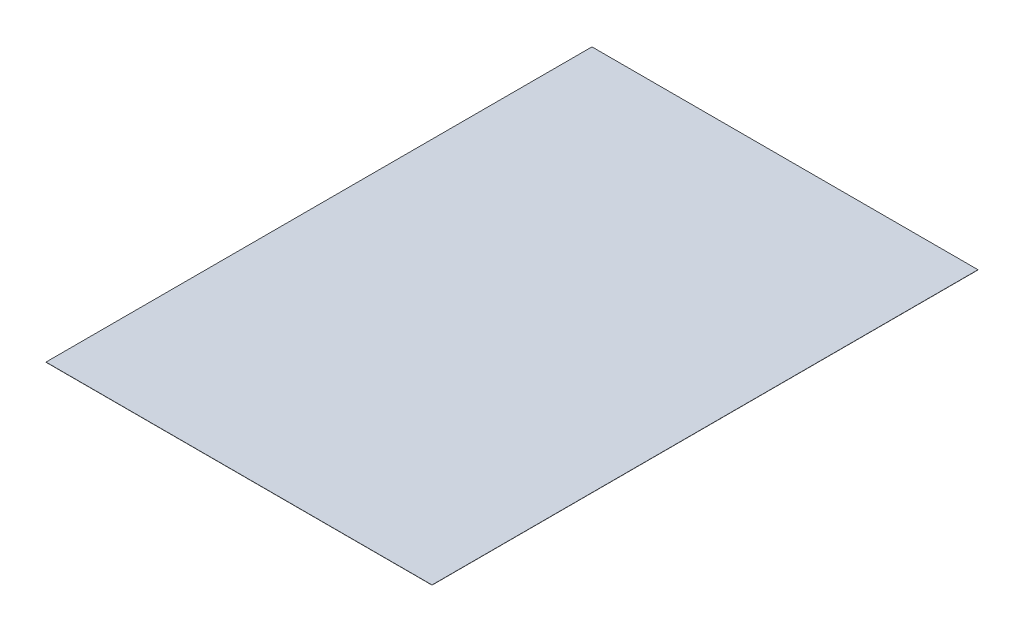
ISO-10303-21;
HEADER;
FILE_DESCRIPTION(('STEP AP214'),'2;1');
FILE_NAME('part.step','',(''),(''),'','','');
FILE_SCHEMA(('AUTOMOTIVE_DESIGN { 1 0 10303 214 1 1 1 1 }'));
ENDSEC;
DATA;
#1=APPLICATION_CONTEXT('core data for automotive mechanical design processes');
#2=APPLICATION_PROTOCOL_DEFINITION('international standard','automotive_design',2000,#1);
#3=PRODUCT_CONTEXT('',#1,'mechanical');
#4=PRODUCT('Part','Part','',(#3));
#5=PRODUCT_RELATED_PRODUCT_CATEGORY('part','',(#4));
#6=PRODUCT_DEFINITION_FORMATION('','',#4);
#7=PRODUCT_DEFINITION_CONTEXT('part definition',#1,'design');
#8=PRODUCT_DEFINITION('design','',#6,#7);
#9=PRODUCT_DEFINITION_SHAPE('','',#8);
#10=(LENGTH_UNIT() NAMED_UNIT(*) SI_UNIT(.MILLI.,.METRE.));
#11=(NAMED_UNIT(*) PLANE_ANGLE_UNIT() SI_UNIT($,.RADIAN.));
#12=(NAMED_UNIT(*) SI_UNIT($,.STERADIAN.) SOLID_ANGLE_UNIT());
#13=UNCERTAINTY_MEASURE_WITH_UNIT(LENGTH_MEASURE(1.E-05),#10,'distance_accuracy_value','');
#14=(GEOMETRIC_REPRESENTATION_CONTEXT(3) GLOBAL_UNCERTAINTY_ASSIGNED_CONTEXT((#13)) GLOBAL_UNIT_ASSIGNED_CONTEXT((#10,
#11,#12)) REPRESENTATION_CONTEXT('',''));
#15=CARTESIAN_POINT('',(0.,0.,0.));
#16=DIRECTION('',(0.,0.,1.));
#17=DIRECTION('',(1.,0.,0.));
#18=AXIS2_PLACEMENT_3D('',#15,#16,#17);
#19=CARTESIAN_POINT('',(0.,0.1,0.));
#20=DIRECTION('',(1.,0.,0.));
#21=DIRECTION('',(0.,0.,-1.));
#22=AXIS2_PLACEMENT_3D('',#19,#20,#21);
#23=PLANE('',#22);
#24=DIRECTION('',(0.,0.,1.));
#25=VECTOR('',#24,1.);
#26=CARTESIAN_POINT('',(0.,0.,0.));
#27=LINE('',#26,#25);
#28=CARTESIAN_POINT('',(0.,0.,-297.));
#29=VERTEX_POINT('',#28);
#30=CARTESIAN_POINT('',(0.,0.,0.));
#31=VERTEX_POINT('',#30);
#32=EDGE_CURVE('E99',#29,#31,#27,.T.);
#33=ORIENTED_EDGE('',*,*,#32,.T.);
#34=DIRECTION('',(0.,-1.,0.));
#35=VECTOR('',#34,1.);
#36=CARTESIAN_POINT('',(0.,0.1,0.));
#37=LINE('',#36,#35);
#38=CARTESIAN_POINT('',(0.,0.1,0.));
#39=VERTEX_POINT('',#38);
#40=EDGE_CURVE('E11',#39,#31,#37,.T.);
#41=ORIENTED_EDGE('',*,*,#40,.F.);
#42=DIRECTION('',(0.,0.,1.));
#43=VECTOR('',#42,1.);
#44=CARTESIAN_POINT('',(0.,0.1,0.));
#45=LINE('',#44,#43);
#46=CARTESIAN_POINT('',(0.,0.1,-297.));
#47=VERTEX_POINT('',#46);
#48=EDGE_CURVE('E87',#47,#39,#45,.T.);
#49=ORIENTED_EDGE('',*,*,#48,.F.);
#50=DIRECTION('',(0.,-1.,0.));
#51=VECTOR('',#50,1.);
#52=CARTESIAN_POINT('',(0.,0.1,-297.));
#53=LINE('',#52,#51);
#54=EDGE_CURVE('E95',#47,#29,#53,.T.);
#55=ORIENTED_EDGE('',*,*,#54,.T.);
#56=EDGE_LOOP('',(#33,#41,#49,#55));
#57=FACE_BOUND('',#56,.T.);
#58=ADVANCED_FACE('F36',(#57),#23,.F.);
#59=CARTESIAN_POINT('',(0.,0.1,0.));
#60=DIRECTION('',(0.,0.,-1.));
#61=DIRECTION('',(-1.,0.,0.));
#62=AXIS2_PLACEMENT_3D('',#59,#60,#61);
#63=PLANE('',#62);
#64=DIRECTION('',(1.,0.,0.));
#65=VECTOR('',#64,1.);
#66=CARTESIAN_POINT('',(0.,0.,0.));
#67=LINE('',#66,#65);
#68=CARTESIAN_POINT('',(210.,0.,0.));
#69=VERTEX_POINT('',#68);
#70=EDGE_CURVE('E91',#31,#69,#67,.T.);
#71=ORIENTED_EDGE('',*,*,#70,.T.);
#72=DIRECTION('',(0.,-1.,0.));
#73=VECTOR('',#72,1.);
#74=CARTESIAN_POINT('',(210.,0.1,0.));
#75=LINE('',#74,#73);
#76=CARTESIAN_POINT('',(210.,0.1,0.));
#77=VERTEX_POINT('',#76);
#78=EDGE_CURVE('E44',#77,#69,#75,.T.);
#79=ORIENTED_EDGE('',*,*,#78,.F.);
#80=DIRECTION('',(1.,0.,0.));
#81=VECTOR('',#80,1.);
#82=CARTESIAN_POINT('',(0.,0.1,0.));
#83=LINE('',#82,#81);
#84=EDGE_CURVE('E82',#39,#77,#83,.T.);
#85=ORIENTED_EDGE('',*,*,#84,.F.);
#86=ORIENTED_EDGE('',*,*,#40,.T.);
#87=EDGE_LOOP('',(#71,#79,#85,#86));
#88=FACE_BOUND('',#87,.T.);
#89=ADVANCED_FACE('F90',(#88),#63,.F.);
#90=CARTESIAN_POINT('',(210.,0.1,0.));
#91=DIRECTION('',(-1.,0.,0.));
#92=DIRECTION('',(0.,0.,1.));
#93=AXIS2_PLACEMENT_3D('',#90,#91,#92);
#94=PLANE('',#93);
#95=DIRECTION('',(0.,0.,-1.));
#96=VECTOR('',#95,1.);
#97=CARTESIAN_POINT('',(210.,0.,0.));
#98=LINE('',#97,#96);
#99=CARTESIAN_POINT('',(210.,0.,-297.));
#100=VERTEX_POINT('',#99);
#101=EDGE_CURVE('E69',#69,#100,#98,.T.);
#102=ORIENTED_EDGE('',*,*,#101,.T.);
#103=DIRECTION('',(0.,-1.,0.));
#104=VECTOR('',#103,1.);
#105=CARTESIAN_POINT('',(210.,0.1,-297.));
#106=LINE('',#105,#104);
#107=CARTESIAN_POINT('',(210.,0.1,-297.));
#108=VERTEX_POINT('',#107);
#109=EDGE_CURVE('E92',#108,#100,#106,.T.);
#110=ORIENTED_EDGE('',*,*,#109,.F.);
#111=DIRECTION('',(0.,0.,-1.));
#112=VECTOR('',#111,1.);
#113=CARTESIAN_POINT('',(210.,0.1,0.));
#114=LINE('',#113,#112);
#115=EDGE_CURVE('E85',#77,#108,#114,.T.);
#116=ORIENTED_EDGE('',*,*,#115,.F.);
#117=ORIENTED_EDGE('',*,*,#78,.T.);
#118=EDGE_LOOP('',(#102,#110,#116,#117));
#119=FACE_BOUND('',#118,.T.);
#120=ADVANCED_FACE('F93',(#119),#94,.F.);
#121=CARTESIAN_POINT('',(0.,0.1,-297.));
#122=DIRECTION('',(0.,0.,1.));
#123=DIRECTION('',(1.,0.,0.));
#124=AXIS2_PLACEMENT_3D('',#121,#122,#123);
#125=PLANE('',#124);
#126=DIRECTION('',(-1.,0.,0.));
#127=VECTOR('',#126,1.);
#128=CARTESIAN_POINT('',(0.,0.,-297.));
#129=LINE('',#128,#127);
#130=EDGE_CURVE('E75',#100,#29,#129,.T.);
#131=ORIENTED_EDGE('',*,*,#130,.T.);
#132=ORIENTED_EDGE('',*,*,#54,.F.);
#133=DIRECTION('',(-1.,0.,0.));
#134=VECTOR('',#133,1.);
#135=CARTESIAN_POINT('',(0.,0.1,-297.));
#136=LINE('',#135,#134);
#137=EDGE_CURVE('E52',#108,#47,#136,.T.);
#138=ORIENTED_EDGE('',*,*,#137,.F.);
#139=ORIENTED_EDGE('',*,*,#109,.T.);
#140=EDGE_LOOP('',(#131,#132,#138,#139));
#141=FACE_BOUND('',#140,.T.);
#142=ADVANCED_FACE('F106',(#141),#125,.F.);
#143=CARTESIAN_POINT('',(0.,0.1,0.));
#144=DIRECTION('',(0.,-1.,0.));
#145=DIRECTION('',(0.,0.,-1.));
#146=AXIS2_PLACEMENT_3D('',#143,#144,#145);
#147=PLANE('',#146);
#148=ORIENTED_EDGE('',*,*,#48,.T.);
#149=ORIENTED_EDGE('',*,*,#84,.T.);
#150=ORIENTED_EDGE('',*,*,#115,.T.);
#151=ORIENTED_EDGE('',*,*,#137,.T.);
#152=EDGE_LOOP('',(#148,#149,#150,#151));
#153=FACE_BOUND('',#152,.T.);
#154=ADVANCED_FACE('F83',(#153),#147,.F.);
#155=CARTESIAN_POINT('',(0.,0.,0.));
#156=DIRECTION('',(0.,-1.,0.));
#157=DIRECTION('',(0.,0.,-1.));
#158=AXIS2_PLACEMENT_3D('',#155,#156,#157);
#159=PLANE('',#158);
#160=ORIENTED_EDGE('',*,*,#32,.F.);
#161=ORIENTED_EDGE('',*,*,#130,.F.);
#162=ORIENTED_EDGE('',*,*,#101,.F.);
#163=ORIENTED_EDGE('',*,*,#70,.F.);
#164=EDGE_LOOP('',(#160,#161,#162,#163));
#165=FACE_BOUND('',#164,.T.);
#166=ADVANCED_FACE('F109',(#165),#159,.T.);
#167=CLOSED_SHELL('',(#58,#89,#120,#142,#154,#166));
#168=MANIFOLD_SOLID_BREP('B2',#167);
#169=ADVANCED_BREP_SHAPE_REPRESENTATION('',(#18,#168),#14);
#170=SHAPE_DEFINITION_REPRESENTATION(#9,#169);
ENDSEC;
END-ISO-10303-21;
